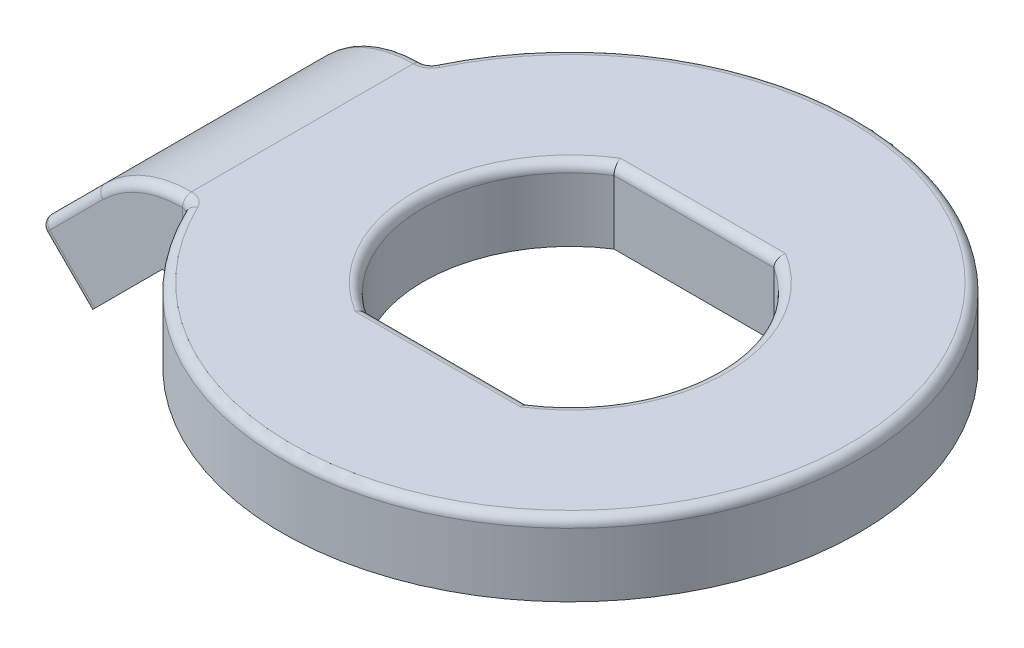
ISO-10303-21;
HEADER;
FILE_DESCRIPTION(('STEP AP214'),'2;1');
FILE_NAME('part.step','',(''),(''),'','','');
FILE_SCHEMA(('AUTOMOTIVE_DESIGN { 1 0 10303 214 1 1 1 1 }'));
ENDSEC;
DATA;
#1=APPLICATION_CONTEXT('core data for automotive mechanical design processes');
#2=APPLICATION_PROTOCOL_DEFINITION('international standard','automotive_design',2000,#1);
#3=PRODUCT_CONTEXT('',#1,'mechanical');
#4=PRODUCT('Part','Part','',(#3));
#5=PRODUCT_RELATED_PRODUCT_CATEGORY('part','',(#4));
#6=PRODUCT_DEFINITION_FORMATION('','',#4);
#7=PRODUCT_DEFINITION_CONTEXT('part definition',#1,'design');
#8=PRODUCT_DEFINITION('design','',#6,#7);
#9=PRODUCT_DEFINITION_SHAPE('','',#8);
#10=(LENGTH_UNIT() NAMED_UNIT(*) SI_UNIT(.MILLI.,.METRE.));
#11=(NAMED_UNIT(*) PLANE_ANGLE_UNIT() SI_UNIT($,.RADIAN.));
#12=(NAMED_UNIT(*) SI_UNIT($,.STERADIAN.) SOLID_ANGLE_UNIT());
#13=UNCERTAINTY_MEASURE_WITH_UNIT(LENGTH_MEASURE(1.E-05),#10,'distance_accuracy_value','');
#14=(GEOMETRIC_REPRESENTATION_CONTEXT(3) GLOBAL_UNCERTAINTY_ASSIGNED_CONTEXT((#13)) GLOBAL_UNIT_ASSIGNED_CONTEXT((#10,
#11,#12)) REPRESENTATION_CONTEXT('',''));
#15=CARTESIAN_POINT('',(0.,0.,0.));
#16=DIRECTION('',(0.,0.,1.));
#17=DIRECTION('',(1.,0.,0.));
#18=AXIS2_PLACEMENT_3D('',#15,#16,#17);
#19=CARTESIAN_POINT('',(0.,3.03784,0.));
#20=DIRECTION('',(0.,1.,0.));
#21=DIRECTION('',(0.,0.,1.));
#22=AXIS2_PLACEMENT_3D('',#19,#20,#21);
#23=PLANE('',#22);
#24=DIRECTION('',(-1.,0.,0.));
#25=VECTOR('',#24,1.);
#26=CARTESIAN_POINT('',(0.,3.03784,-5.5372));
#27=LINE('',#26,#25);
#28=CARTESIAN_POINT('',(-3.44510177824982,3.03784,-5.53719999999999));
#29=VERTEX_POINT('',#28);
#30=CARTESIAN_POINT('',(3.44510177824982,3.03784,-5.5372));
#31=VERTEX_POINT('',#30);
#32=EDGE_CURVE('E291',#29,#31,#27,.F.);
#33=ORIENTED_EDGE('',*,*,#32,.T.);
#34=CARTESIAN_POINT('',(0.,3.03784,0.));
#35=DIRECTION('',(0.,1.,0.));
#36=DIRECTION('',(0.,0.,1.));
#37=AXIS2_PLACEMENT_3D('',#34,#35,#36);
#38=CIRCLE('',#37,6.52145);
#39=CARTESIAN_POINT('',(3.44510177824982,3.03784,5.5372));
#40=VERTEX_POINT('',#39);
#41=EDGE_CURVE('E293',#31,#40,#38,.F.);
#42=ORIENTED_EDGE('',*,*,#41,.T.);
#43=DIRECTION('',(1.,0.,0.));
#44=VECTOR('',#43,1.);
#45=CARTESIAN_POINT('',(0.,3.03784,5.5372));
#46=LINE('',#45,#44);
#47=CARTESIAN_POINT('',(-3.44510177824982,3.03784,5.5372));
#48=VERTEX_POINT('',#47);
#49=EDGE_CURVE('E287',#40,#48,#46,.F.);
#50=ORIENTED_EDGE('',*,*,#49,.T.);
#51=CARTESIAN_POINT('',(0.,3.03784,0.));
#52=DIRECTION('',(0.,1.,0.));
#53=DIRECTION('',(0.,0.,1.));
#54=AXIS2_PLACEMENT_3D('',#51,#52,#53);
#55=CIRCLE('',#54,6.52145);
#56=EDGE_CURVE('E289',#48,#29,#55,.F.);
#57=ORIENTED_EDGE('',*,*,#56,.T.);
#58=EDGE_LOOP('',(#33,#42,#50,#57));
#59=FACE_BOUND('',#58,.T.);
#60=DIRECTION('',(0.,0.,-1.));
#61=VECTOR('',#60,1.);
#62=CARTESIAN_POINT('',(-11.1810096314642,3.03784,5.0038));
#63=LINE('',#62,#61);
#64=CARTESIAN_POINT('',(-11.1810096314642,3.03784,-4.6228));
#65=VERTEX_POINT('',#64);
#66=CARTESIAN_POINT('',(-11.1810096314642,3.03784,4.6228));
#67=VERTEX_POINT('',#66);
#68=EDGE_CURVE('E254',#65,#67,#63,.F.);
#69=ORIENTED_EDGE('',*,*,#68,.T.);
#70=DIRECTION('',(-1.,0.,0.));
#71=VECTOR('',#70,1.);
#72=CARTESIAN_POINT('',(0.,3.03784,4.6228));
#73=LINE('',#72,#71);
#74=CARTESIAN_POINT('',(-11.1785469256966,3.03784,4.6228));
#75=VERTEX_POINT('',#74);
#76=EDGE_CURVE('E306',#67,#75,#73,.F.);
#77=ORIENTED_EDGE('',*,*,#76,.T.);
#78=CARTESIAN_POINT('',(-11.1785469256966,3.03784,5.3848));
#79=DIRECTION('',(0.,1.,0.));
#80=DIRECTION('',(0.,0.,1.));
#81=AXIS2_PLACEMENT_3D('',#78,#79,#80);
#82=CIRCLE('',#81,0.762);
#83=CARTESIAN_POINT('',(-10.4920445556435,3.03784,5.05410603889458));
#84=VERTEX_POINT('',#83);
#85=EDGE_CURVE('E303',#84,#75,#82,.T.);
#86=ORIENTED_EDGE('',*,*,#85,.F.);
#87=CARTESIAN_POINT('',(0.,3.03784,0.));
#88=DIRECTION('',(0.,1.,0.));
#89=DIRECTION('',(0.,0.,1.));
#90=AXIS2_PLACEMENT_3D('',#87,#88,#89);
#91=CIRCLE('',#90,11.6459);
#92=CARTESIAN_POINT('',(-10.4920445556435,3.03784,-5.05410603889458));
#93=VERTEX_POINT('',#92);
#94=EDGE_CURVE('E301',#84,#93,#91,.T.);
#95=ORIENTED_EDGE('',*,*,#94,.T.);
#96=CARTESIAN_POINT('',(-11.1785469256966,3.03784,-5.3848));
#97=DIRECTION('',(0.,1.,0.));
#98=DIRECTION('',(0.,0.,1.));
#99=AXIS2_PLACEMENT_3D('',#96,#97,#98);
#100=CIRCLE('',#99,0.762);
#101=CARTESIAN_POINT('',(-11.1785469256966,3.03784,-4.6228));
#102=VERTEX_POINT('',#101);
#103=EDGE_CURVE('E298',#102,#93,#100,.T.);
#104=ORIENTED_EDGE('',*,*,#103,.F.);
#105=DIRECTION('',(-1.,0.,0.));
#106=VECTOR('',#105,1.);
#107=CARTESIAN_POINT('',(-11.1810096314642,3.03784,-4.6228));
#108=LINE('',#107,#106);
#109=EDGE_CURVE('E296',#102,#65,#108,.T.);
#110=ORIENTED_EDGE('',*,*,#109,.T.);
#111=EDGE_LOOP('',(#69,#77,#86,#95,#104,#110));
#112=FACE_BOUND('',#111,.T.);
#113=ADVANCED_FACE('F41',(#59,#112),#23,.T.);
#114=CARTESIAN_POINT('',(0.,0.,0.));
#115=DIRECTION('',(0.,1.,0.));
#116=DIRECTION('',(0.,0.,1.));
#117=AXIS2_PLACEMENT_3D('',#114,#115,#116);
#118=PLANE('',#117);
#119=CARTESIAN_POINT('',(0.,0.,0.));
#120=DIRECTION('',(0.,1.,0.));
#121=DIRECTION('',(0.,0.,1.));
#122=AXIS2_PLACEMENT_3D('',#119,#120,#121);
#123=CIRCLE('',#122,6.14045);
#124=CARTESIAN_POINT('',(-3.33447563531359,0.,-5.1562));
#125=VERTEX_POINT('',#124);
#126=CARTESIAN_POINT('',(-3.33447563531359,0.,5.1562));
#127=VERTEX_POINT('',#126);
#128=EDGE_CURVE('E228',#125,#127,#123,.T.);
#129=ORIENTED_EDGE('',*,*,#128,.T.);
#130=DIRECTION('',(1.,0.,0.));
#131=VECTOR('',#130,1.);
#132=CARTESIAN_POINT('',(3.33447563531359,0.,5.1562));
#133=LINE('',#132,#131);
#134=CARTESIAN_POINT('',(3.33447563531359,0.,5.1562));
#135=VERTEX_POINT('',#134);
#136=EDGE_CURVE('E231',#127,#135,#133,.T.);
#137=ORIENTED_EDGE('',*,*,#136,.T.);
#138=CARTESIAN_POINT('',(0.,0.,0.));
#139=DIRECTION('',(0.,1.,0.));
#140=DIRECTION('',(0.,0.,1.));
#141=AXIS2_PLACEMENT_3D('',#138,#139,#140);
#142=CIRCLE('',#141,6.14045);
#143=CARTESIAN_POINT('',(3.33447563531359,0.,-5.1562));
#144=VERTEX_POINT('',#143);
#145=EDGE_CURVE('E234',#135,#144,#142,.T.);
#146=ORIENTED_EDGE('',*,*,#145,.T.);
#147=DIRECTION('',(-1.,0.,0.));
#148=VECTOR('',#147,1.);
#149=CARTESIAN_POINT('',(-3.33447563531359,0.,-5.1562));
#150=LINE('',#149,#148);
#151=EDGE_CURVE('E237',#144,#125,#150,.T.);
#152=ORIENTED_EDGE('',*,*,#151,.T.);
#153=EDGE_LOOP('',(#129,#137,#146,#152));
#154=FACE_BOUND('',#153,.T.);
#155=CARTESIAN_POINT('',(0.,0.,0.));
#156=DIRECTION('',(0.,1.,0.));
#157=DIRECTION('',(0.,0.,1.));
#158=AXIS2_PLACEMENT_3D('',#155,#156,#157);
#159=CIRCLE('',#158,12.0269);
#160=CARTESIAN_POINT('',(-10.8352957406701,0.,5.21945301944729));
#161=VERTEX_POINT('',#160);
#162=CARTESIAN_POINT('',(-10.8352957406701,0.,-5.21945301944729));
#163=VERTEX_POINT('',#162);
#164=EDGE_CURVE('E248',#161,#163,#159,.T.);
#165=ORIENTED_EDGE('',*,*,#164,.F.);
#166=CARTESIAN_POINT('',(-11.1785469256966,0.,5.3848));
#167=DIRECTION('',(0.,1.,0.));
#168=DIRECTION('',(0.,0.,1.));
#169=AXIS2_PLACEMENT_3D('',#166,#167,#168);
#170=CIRCLE('',#169,0.381);
#171=CARTESIAN_POINT('',(-11.1785469256966,0.,5.0038));
#172=VERTEX_POINT('',#171);
#173=EDGE_CURVE('E55',#161,#172,#170,.T.);
#174=ORIENTED_EDGE('',*,*,#173,.T.);
#175=DIRECTION('',(1.,0.,0.));
#176=VECTOR('',#175,1.);
#177=CARTESIAN_POINT('',(-12.0269,0.,5.0038));
#178=LINE('',#177,#176);
#179=CARTESIAN_POINT('',(-12.0269,0.,5.0038));
#180=VERTEX_POINT('',#179);
#181=EDGE_CURVE('E199',#180,#172,#178,.T.);
#182=ORIENTED_EDGE('',*,*,#181,.F.);
#183=DIRECTION('',(0.,0.,-1.));
#184=VECTOR('',#183,1.);
#185=CARTESIAN_POINT('',(-12.0269,0.,5.0038));
#186=LINE('',#185,#184);
#187=CARTESIAN_POINT('',(-12.0269,0.,-5.0038));
#188=VERTEX_POINT('',#187);
#189=EDGE_CURVE('E209',#180,#188,#186,.T.);
#190=ORIENTED_EDGE('',*,*,#189,.T.);
#191=DIRECTION('',(1.,0.,0.));
#192=VECTOR('',#191,1.);
#193=CARTESIAN_POINT('',(-12.0269,0.,-5.0038));
#194=LINE('',#193,#192);
#195=CARTESIAN_POINT('',(-11.1785469256966,0.,-5.0038));
#196=VERTEX_POINT('',#195);
#197=EDGE_CURVE('E206',#188,#196,#194,.T.);
#198=ORIENTED_EDGE('',*,*,#197,.T.);
#199=CARTESIAN_POINT('',(-11.1785469256966,0.,-5.3848));
#200=DIRECTION('',(0.,1.,0.));
#201=DIRECTION('',(0.,0.,1.));
#202=AXIS2_PLACEMENT_3D('',#199,#200,#201);
#203=CIRCLE('',#202,0.381);
#204=EDGE_CURVE('E11',#196,#163,#203,.T.);
#205=ORIENTED_EDGE('',*,*,#204,.T.);
#206=EDGE_LOOP('',(#165,#174,#182,#190,#198,#205));
#207=FACE_BOUND('',#206,.T.);
#208=ADVANCED_FACE('F219',(#154,#207),#118,.F.);
#209=CARTESIAN_POINT('',(0.,3.03784,0.));
#210=DIRECTION('',(0.,-1.,0.));
#211=DIRECTION('',(0.,0.,-1.));
#212=AXIS2_PLACEMENT_3D('',#209,#210,#211);
#213=CYLINDRICAL_SURFACE('',#212,12.0269);
#214=CARTESIAN_POINT('',(0.,2.65684,0.));
#215=DIRECTION('',(0.,1.,0.));
#216=DIRECTION('',(0.,0.,1.));
#217=AXIS2_PLACEMENT_3D('',#214,#215,#216);
#218=CIRCLE('',#217,12.0269);
#219=CARTESIAN_POINT('',(-10.8352957406701,2.65684,-5.21945301944729));
#220=VERTEX_POINT('',#219);
#221=CARTESIAN_POINT('',(-10.8352957406701,2.65684,5.21945301944729));
#222=VERTEX_POINT('',#221);
#223=EDGE_CURVE('E310',#220,#222,#218,.F.);
#224=ORIENTED_EDGE('',*,*,#223,.T.);
#225=DIRECTION('',(0.,-1.,0.));
#226=VECTOR('',#225,1.);
#227=CARTESIAN_POINT('',(-10.8352957406701,3.03784,5.21945301944729));
#228=LINE('',#227,#226);
#229=EDGE_CURVE('E312',#222,#161,#228,.T.);
#230=ORIENTED_EDGE('',*,*,#229,.T.);
#231=ORIENTED_EDGE('',*,*,#164,.T.);
#232=DIRECTION('',(0.,-1.,0.));
#233=VECTOR('',#232,1.);
#234=CARTESIAN_POINT('',(-10.8352957406701,3.03784,-5.21945301944729));
#235=LINE('',#234,#233);
#236=EDGE_CURVE('E308',#163,#220,#235,.F.);
#237=ORIENTED_EDGE('',*,*,#236,.T.);
#238=EDGE_LOOP('',(#224,#230,#231,#237));
#239=FACE_BOUND('',#238,.T.);
#240=ADVANCED_FACE('F442',(#239),#213,.T.);
#241=CARTESIAN_POINT('',(0.,3.03784,0.));
#242=DIRECTION('',(0.,-1.,0.));
#243=DIRECTION('',(0.,0.,-1.));
#244=AXIS2_PLACEMENT_3D('',#241,#242,#243);
#245=CYLINDRICAL_SURFACE('',#244,6.14045);
#246=DIRECTION('',(0.,-1.,0.));
#247=VECTOR('',#246,1.);
#248=CARTESIAN_POINT('',(-3.33447563531359,3.03784,-5.1562));
#249=LINE('',#248,#247);
#250=CARTESIAN_POINT('',(-3.33447563531359,2.65684,-5.1562));
#251=VERTEX_POINT('',#250);
#252=EDGE_CURVE('E240',#251,#125,#249,.T.);
#253=ORIENTED_EDGE('',*,*,#252,.F.);
#254=CARTESIAN_POINT('',(0.,2.65684,0.));
#255=DIRECTION('',(0.,1.,0.));
#256=DIRECTION('',(0.,0.,1.));
#257=AXIS2_PLACEMENT_3D('',#254,#255,#256);
#258=CIRCLE('',#257,6.14045);
#259=CARTESIAN_POINT('',(-3.33447563531359,2.65684,5.1562));
#260=VERTEX_POINT('',#259);
#261=EDGE_CURVE('E319',#251,#260,#258,.T.);
#262=ORIENTED_EDGE('',*,*,#261,.T.);
#263=DIRECTION('',(0.,-1.,0.));
#264=VECTOR('',#263,1.);
#265=CARTESIAN_POINT('',(-3.33447563531359,3.03784,5.1562));
#266=LINE('',#265,#264);
#267=EDGE_CURVE('E246',#260,#127,#266,.T.);
#268=ORIENTED_EDGE('',*,*,#267,.T.);
#269=ORIENTED_EDGE('',*,*,#128,.F.);
#270=EDGE_LOOP('',(#253,#262,#268,#269));
#271=FACE_BOUND('',#270,.T.);
#272=ADVANCED_FACE('F440',(#271),#245,.F.);
#273=CARTESIAN_POINT('',(3.33447563531359,3.03784,5.1562));
#274=DIRECTION('',(0.,0.,-1.));
#275=DIRECTION('',(-1.,0.,0.));
#276=AXIS2_PLACEMENT_3D('',#273,#274,#275);
#277=PLANE('',#276);
#278=ORIENTED_EDGE('',*,*,#267,.F.);
#279=DIRECTION('',(1.,0.,0.));
#280=VECTOR('',#279,1.);
#281=CARTESIAN_POINT('',(3.33447563531359,2.65684,5.1562));
#282=LINE('',#281,#280);
#283=CARTESIAN_POINT('',(3.33447563531359,2.65684,5.1562));
#284=VERTEX_POINT('',#283);
#285=EDGE_CURVE('E321',#260,#284,#282,.T.);
#286=ORIENTED_EDGE('',*,*,#285,.T.);
#287=DIRECTION('',(0.,-1.,0.));
#288=VECTOR('',#287,1.);
#289=CARTESIAN_POINT('',(3.33447563531359,3.03784,5.1562));
#290=LINE('',#289,#288);
#291=EDGE_CURVE('E244',#284,#135,#290,.T.);
#292=ORIENTED_EDGE('',*,*,#291,.T.);
#293=ORIENTED_EDGE('',*,*,#136,.F.);
#294=EDGE_LOOP('',(#278,#286,#292,#293));
#295=FACE_BOUND('',#294,.T.);
#296=ADVANCED_FACE('F436',(#295),#277,.T.);
#297=CARTESIAN_POINT('',(0.,3.03784,0.));
#298=DIRECTION('',(0.,-1.,0.));
#299=DIRECTION('',(0.,0.,-1.));
#300=AXIS2_PLACEMENT_3D('',#297,#298,#299);
#301=CYLINDRICAL_SURFACE('',#300,6.14045);
#302=ORIENTED_EDGE('',*,*,#291,.F.);
#303=CARTESIAN_POINT('',(0.,2.65684,0.));
#304=DIRECTION('',(0.,1.,0.));
#305=DIRECTION('',(0.,0.,1.));
#306=AXIS2_PLACEMENT_3D('',#303,#304,#305);
#307=CIRCLE('',#306,6.14045);
#308=CARTESIAN_POINT('',(3.33447563531359,2.65684,-5.1562));
#309=VERTEX_POINT('',#308);
#310=EDGE_CURVE('E314',#284,#309,#307,.T.);
#311=ORIENTED_EDGE('',*,*,#310,.T.);
#312=DIRECTION('',(0.,-1.,0.));
#313=VECTOR('',#312,1.);
#314=CARTESIAN_POINT('',(3.33447563531359,3.03784,-5.1562));
#315=LINE('',#314,#313);
#316=EDGE_CURVE('E242',#309,#144,#315,.T.);
#317=ORIENTED_EDGE('',*,*,#316,.T.);
#318=ORIENTED_EDGE('',*,*,#145,.F.);
#319=EDGE_LOOP('',(#302,#311,#317,#318));
#320=FACE_BOUND('',#319,.T.);
#321=ADVANCED_FACE('F427',(#320),#301,.F.);
#322=CARTESIAN_POINT('',(-3.33447563531359,3.03784,-5.1562));
#323=DIRECTION('',(0.,0.,1.));
#324=DIRECTION('',(1.,0.,0.));
#325=AXIS2_PLACEMENT_3D('',#322,#323,#324);
#326=PLANE('',#325);
#327=ORIENTED_EDGE('',*,*,#316,.F.);
#328=DIRECTION('',(-1.,0.,0.));
#329=VECTOR('',#328,1.);
#330=CARTESIAN_POINT('',(-3.33447563531359,2.65684,-5.1562));
#331=LINE('',#330,#329);
#332=EDGE_CURVE('E317',#309,#251,#331,.T.);
#333=ORIENTED_EDGE('',*,*,#332,.T.);
#334=ORIENTED_EDGE('',*,*,#252,.T.);
#335=ORIENTED_EDGE('',*,*,#151,.F.);
#336=EDGE_LOOP('',(#327,#333,#334,#335));
#337=FACE_BOUND('',#336,.T.);
#338=ADVANCED_FACE('F430',(#337),#326,.T.);
#339=CARTESIAN_POINT('',(0.,0.,5.0038));
#340=DIRECTION('',(0.,0.,1.));
#341=DIRECTION('',(1.,0.,0.));
#342=AXIS2_PLACEMENT_3D('',#339,#340,#341);
#343=PLANE('',#342);
#344=ORIENTED_EDGE('',*,*,#181,.T.);
#345=DIRECTION('',(0.,-1.,0.));
#346=VECTOR('',#345,1.);
#347=CARTESIAN_POINT('',(-11.1785469256966,0.,5.0038));
#348=LINE('',#347,#346);
#349=CARTESIAN_POINT('',(-11.1785469256966,2.65684,5.0038));
#350=VERTEX_POINT('',#349);
#351=EDGE_CURVE('E264',#172,#350,#348,.F.);
#352=ORIENTED_EDGE('',*,*,#351,.T.);
#353=DIRECTION('',(-1.,0.,0.));
#354=VECTOR('',#353,1.);
#355=CARTESIAN_POINT('',(0.,2.65684,5.0038));
#356=LINE('',#355,#354);
#357=CARTESIAN_POINT('',(-11.1810096314642,2.65684,5.0038));
#358=VERTEX_POINT('',#357);
#359=EDGE_CURVE('E262',#350,#358,#356,.T.);
#360=ORIENTED_EDGE('',*,*,#359,.T.);
#361=CARTESIAN_POINT('',(-11.1810096314642,-2.04216,5.0038));
#362=DIRECTION('',(0.,0.,1.));
#363=DIRECTION('',(1.,0.,0.));
#364=AXIS2_PLACEMENT_3D('',#361,#362,#363);
#365=CIRCLE('',#364,4.699);
#366=CARTESIAN_POINT('',(-14.5037043962597,1.28053476479558,5.0038));
#367=VERTEX_POINT('',#366);
#368=EDGE_CURVE('E260',#358,#367,#365,.T.);
#369=ORIENTED_EDGE('',*,*,#368,.T.);
#370=DIRECTION('',(-0.707106781186546,-0.707106781186549,0.));
#371=VECTOR('',#370,1.);
#372=CARTESIAN_POINT('',(-16.9857974300544,-1.20155826899906,5.0038));
#373=LINE('',#372,#371);
#374=CARTESIAN_POINT('',(-16.7163897464223,-0.932150585366987,5.0038));
#375=VERTEX_POINT('',#374);
#376=EDGE_CURVE('E258',#367,#375,#373,.T.);
#377=ORIENTED_EDGE('',*,*,#376,.T.);
#378=DIRECTION('',(0.707106781186549,-0.707106781186546,0.));
#379=VECTOR('',#378,1.);
#380=CARTESIAN_POINT('',(-14.8377201658946,-2.81082016589465,5.0038));
#381=LINE('',#380,#379);
#382=CARTESIAN_POINT('',(-14.8377201658946,-2.81082016589465,5.0038));
#383=VERTEX_POINT('',#382);
#384=EDGE_CURVE('E203',#375,#383,#381,.T.);
#385=ORIENTED_EDGE('',*,*,#384,.T.);
#386=DIRECTION('',(0.707106781186546,0.707106781186549,0.));
#387=VECTOR('',#386,1.);
#388=CARTESIAN_POINT('',(-15.1071278495267,-3.08022784952673,5.0038));
#389=LINE('',#388,#387);
#390=EDGE_CURVE('E195',#383,#180,#389,.T.);
#391=ORIENTED_EDGE('',*,*,#390,.T.);
#392=EDGE_LOOP('',(#344,#352,#360,#369,#377,#385,#391));
#393=FACE_BOUND('',#392,.T.);
#394=ADVANCED_FACE('F197',(#393),#343,.T.);
#395=CARTESIAN_POINT('',(0.,0.,-5.0038));
#396=DIRECTION('',(0.,0.,1.));
#397=DIRECTION('',(1.,0.,0.));
#398=AXIS2_PLACEMENT_3D('',#395,#396,#397);
#399=PLANE('',#398);
#400=DIRECTION('',(-1.,0.,0.));
#401=VECTOR('',#400,1.);
#402=CARTESIAN_POINT('',(-10.9365583786674,2.65684,-5.0038));
#403=LINE('',#402,#401);
#404=CARTESIAN_POINT('',(-11.1810096314642,2.65684,-5.0038));
#405=VERTEX_POINT('',#404);
#406=CARTESIAN_POINT('',(-11.1785469256966,2.65684,-5.0038));
#407=VERTEX_POINT('',#406);
#408=EDGE_CURVE('E283',#405,#407,#403,.F.);
#409=ORIENTED_EDGE('',*,*,#408,.T.);
#410=DIRECTION('',(0.,1.,0.));
#411=VECTOR('',#410,1.);
#412=CARTESIAN_POINT('',(-11.1785469256966,0.,-5.0038));
#413=LINE('',#412,#411);
#414=EDGE_CURVE('E285',#407,#196,#413,.F.);
#415=ORIENTED_EDGE('',*,*,#414,.T.);
#416=ORIENTED_EDGE('',*,*,#197,.F.);
#417=DIRECTION('',(0.707106781186546,0.707106781186549,0.));
#418=VECTOR('',#417,1.);
#419=CARTESIAN_POINT('',(-15.1071278495267,-3.08022784952673,-5.0038));
#420=LINE('',#419,#418);
#421=CARTESIAN_POINT('',(-14.8377201658946,-2.81082016589465,-5.0038));
#422=VERTEX_POINT('',#421);
#423=EDGE_CURVE('E212',#422,#188,#420,.T.);
#424=ORIENTED_EDGE('',*,*,#423,.F.);
#425=DIRECTION('',(0.707106781186549,-0.707106781186546,0.));
#426=VECTOR('',#425,1.);
#427=CARTESIAN_POINT('',(-8.82427016589461,-8.82427016589465,-5.0038));
#428=LINE('',#427,#426);
#429=CARTESIAN_POINT('',(-16.7163897464223,-0.932150585366989,-5.0038));
#430=VERTEX_POINT('',#429);
#431=EDGE_CURVE('E277',#422,#430,#428,.F.);
#432=ORIENTED_EDGE('',*,*,#431,.T.);
#433=DIRECTION('',(-0.707106781186546,-0.707106781186549,0.));
#434=VECTOR('',#433,1.);
#435=CARTESIAN_POINT('',(-7.89211958052769,7.89211958052766,-5.0038));
#436=LINE('',#435,#434);
#437=CARTESIAN_POINT('',(-14.5037043962597,1.28053476479558,-5.0038));
#438=VERTEX_POINT('',#437);
#439=EDGE_CURVE('E279',#430,#438,#436,.F.);
#440=ORIENTED_EDGE('',*,*,#439,.T.);
#441=CARTESIAN_POINT('',(-11.1810096314642,-2.04216,-5.0038));
#442=DIRECTION('',(0.,0.,1.));
#443=DIRECTION('',(1.,0.,0.));
#444=AXIS2_PLACEMENT_3D('',#441,#442,#443);
#445=CIRCLE('',#444,4.699);
#446=EDGE_CURVE('E281',#438,#405,#445,.F.);
#447=ORIENTED_EDGE('',*,*,#446,.T.);
#448=EDGE_LOOP('',(#409,#415,#416,#424,#432,#440,#447));
#449=FACE_BOUND('',#448,.T.);
#450=ADVANCED_FACE('F563',(#449),#399,.F.);
#451=CARTESIAN_POINT('',(-13.2852145283195,3.03784,5.0038));
#452=DIRECTION('',(0.707106781186549,-0.707106781186546,0.));
#453=DIRECTION('',(0.707106781186546,0.707106781186549,0.));
#454=AXIS2_PLACEMENT_3D('',#451,#452,#453);
#455=PLANE('',#454);
#456=DIRECTION('',(0.,0.,-1.));
#457=VECTOR('',#456,1.);
#458=CARTESIAN_POINT('',(-16.9857974300544,-0.662742901734914,5.0038));
#459=LINE('',#458,#457);
#460=CARTESIAN_POINT('',(-16.9857974300544,-0.662742901734914,-4.6228));
#461=VERTEX_POINT('',#460);
#462=CARTESIAN_POINT('',(-16.9857974300544,-0.662742901734914,4.6228));
#463=VERTEX_POINT('',#462);
#464=EDGE_CURVE('E266',#461,#463,#459,.F.);
#465=ORIENTED_EDGE('',*,*,#464,.T.);
#466=DIRECTION('',(-0.707106781186546,-0.707106781186549,0.));
#467=VECTOR('',#466,1.);
#468=CARTESIAN_POINT('',(-14.7731120798918,1.54994244842765,4.6228));
#469=LINE('',#468,#467);
#470=CARTESIAN_POINT('',(-14.7731120798918,1.54994244842765,4.6228));
#471=VERTEX_POINT('',#470);
#472=EDGE_CURVE('E270',#463,#471,#469,.F.);
#473=ORIENTED_EDGE('',*,*,#472,.T.);
#474=DIRECTION('',(0.,0.,-1.));
#475=VECTOR('',#474,1.);
#476=CARTESIAN_POINT('',(-14.7731120798918,1.54994244842765,-5.0038));
#477=LINE('',#476,#475);
#478=CARTESIAN_POINT('',(-14.7731120798918,1.54994244842765,-4.6228));
#479=VERTEX_POINT('',#478);
#480=EDGE_CURVE('E251',#471,#479,#477,.T.);
#481=ORIENTED_EDGE('',*,*,#480,.T.);
#482=DIRECTION('',(-0.707106781186546,-0.707106781186549,0.));
#483=VECTOR('',#482,1.);
#484=CARTESIAN_POINT('',(-13.2852145283195,3.03784,-4.6228));
#485=LINE('',#484,#483);
#486=EDGE_CURVE('E268',#479,#461,#485,.T.);
#487=ORIENTED_EDGE('',*,*,#486,.T.);
#488=EDGE_LOOP('',(#465,#473,#481,#487));
#489=FACE_BOUND('',#488,.T.);
#490=ADVANCED_FACE('F556',(#489),#455,.F.);
#491=CARTESIAN_POINT('',(-17.2552051136865,-0.932150585366989,5.0038));
#492=DIRECTION('',(0.707106781186546,0.707106781186549,0.));
#493=DIRECTION('',(-0.707106781186549,0.707106781186546,0.));
#494=AXIS2_PLACEMENT_3D('',#491,#492,#493);
#495=PLANE('',#494);
#496=DIRECTION('',(0.,0.,-1.));
#497=VECTOR('',#496,1.);
#498=CARTESIAN_POINT('',(-15.1071278495267,-3.08022784952673,5.0038));
#499=LINE('',#498,#497);
#500=CARTESIAN_POINT('',(-15.1071278495267,-3.08022784952673,4.6228));
#501=VERTEX_POINT('',#500);
#502=CARTESIAN_POINT('',(-15.1071278495267,-3.08022784952673,-4.6228));
#503=VERTEX_POINT('',#502);
#504=EDGE_CURVE('E216',#501,#503,#499,.T.);
#505=ORIENTED_EDGE('',*,*,#504,.F.);
#506=DIRECTION('',(0.707106781186549,-0.707106781186546,0.));
#507=VECTOR('',#506,1.);
#508=CARTESIAN_POINT('',(-17.2552051136865,-0.932150585366989,4.6228));
#509=LINE('',#508,#507);
#510=CARTESIAN_POINT('',(-16.9857974300544,-1.20155826899906,4.6228));
#511=VERTEX_POINT('',#510);
#512=EDGE_CURVE('E63',#501,#511,#509,.F.);
#513=ORIENTED_EDGE('',*,*,#512,.T.);
#514=DIRECTION('',(0.,0.,-1.));
#515=VECTOR('',#514,1.);
#516=CARTESIAN_POINT('',(-16.9857974300544,-1.20155826899906,5.0038));
#517=LINE('',#516,#515);
#518=CARTESIAN_POINT('',(-16.9857974300544,-1.20155826899907,-4.6228));
#519=VERTEX_POINT('',#518);
#520=EDGE_CURVE('E67',#511,#519,#517,.T.);
#521=ORIENTED_EDGE('',*,*,#520,.T.);
#522=DIRECTION('',(0.707106781186549,-0.707106781186546,0.));
#523=VECTOR('',#522,1.);
#524=CARTESIAN_POINT('',(-17.2552051136865,-0.932150585366989,-4.6228));
#525=LINE('',#524,#523);
#526=EDGE_CURVE('E323',#519,#503,#525,.T.);
#527=ORIENTED_EDGE('',*,*,#526,.T.);
#528=EDGE_LOOP('',(#505,#513,#521,#527));
#529=FACE_BOUND('',#528,.T.);
#530=ADVANCED_FACE('F549',(#529),#495,.F.);
#531=CARTESIAN_POINT('',(-15.1071278495267,-3.08022784952673,5.0038));
#532=DIRECTION('',(-0.707106781186549,0.707106781186546,0.));
#533=DIRECTION('',(-0.707106781186546,-0.707106781186549,0.));
#534=AXIS2_PLACEMENT_3D('',#531,#532,#533);
#535=PLANE('',#534);
#536=ORIENTED_EDGE('',*,*,#390,.F.);
#537=CARTESIAN_POINT('',(-14.8377201658946,-2.81082016589465,4.6228));
#538=DIRECTION('',(-0.707106781186549,0.707106781186546,0.));
#539=DIRECTION('',(-0.707106781186546,-0.707106781186549,0.));
#540=AXIS2_PLACEMENT_3D('',#537,#538,#539);
#541=CIRCLE('',#540,0.381);
#542=EDGE_CURVE('E329',#383,#501,#541,.F.);
#543=ORIENTED_EDGE('',*,*,#542,.T.);
#544=ORIENTED_EDGE('',*,*,#504,.T.);
#545=CARTESIAN_POINT('',(-14.8377201658946,-2.81082016589465,-4.6228));
#546=DIRECTION('',(-0.707106781186549,0.707106781186546,0.));
#547=DIRECTION('',(-0.707106781186546,-0.707106781186549,0.));
#548=AXIS2_PLACEMENT_3D('',#545,#546,#547);
#549=CIRCLE('',#548,0.381);
#550=EDGE_CURVE('E327',#503,#422,#549,.F.);
#551=ORIENTED_EDGE('',*,*,#550,.T.);
#552=ORIENTED_EDGE('',*,*,#423,.T.);
#553=ORIENTED_EDGE('',*,*,#189,.F.);
#554=EDGE_LOOP('',(#536,#543,#544,#551,#552,#553));
#555=FACE_BOUND('',#554,.T.);
#556=ADVANCED_FACE('F210',(#555),#535,.F.);
#557=CARTESIAN_POINT('',(-11.1810096314642,-2.04216,5.0038));
#558=DIRECTION('',(0.,0.,1.));
#559=DIRECTION('',(1.,0.,0.));
#560=AXIS2_PLACEMENT_3D('',#557,#558,#559);
#561=CYLINDRICAL_SURFACE('',#560,5.08);
#562=ORIENTED_EDGE('',*,*,#480,.F.);
#563=CARTESIAN_POINT('',(-11.1810096314642,-2.04216,4.6228));
#564=DIRECTION('',(0.,0.,1.));
#565=DIRECTION('',(1.,0.,0.));
#566=AXIS2_PLACEMENT_3D('',#563,#564,#565);
#567=CIRCLE('',#566,5.08);
#568=EDGE_CURVE('E275',#471,#67,#567,.F.);
#569=ORIENTED_EDGE('',*,*,#568,.T.);
#570=ORIENTED_EDGE('',*,*,#68,.F.);
#571=CARTESIAN_POINT('',(-11.1810096314642,-2.04216,-4.6228));
#572=DIRECTION('',(0.,0.,1.));
#573=DIRECTION('',(1.,0.,0.));
#574=AXIS2_PLACEMENT_3D('',#571,#572,#573);
#575=CIRCLE('',#574,5.08);
#576=EDGE_CURVE('E273',#65,#479,#575,.T.);
#577=ORIENTED_EDGE('',*,*,#576,.T.);
#578=EDGE_LOOP('',(#562,#569,#570,#577));
#579=FACE_BOUND('',#578,.T.);
#580=ADVANCED_FACE('F458',(#579),#561,.T.);
#581=CARTESIAN_POINT('',(-11.1785469256966,3.03784,-5.3848));
#582=DIRECTION('',(0.,-1.,0.));
#583=DIRECTION('',(0.,0.,-1.));
#584=AXIS2_PLACEMENT_3D('',#581,#582,#583);
#585=CYLINDRICAL_SURFACE('',#584,0.381);
#586=ORIENTED_EDGE('',*,*,#204,.F.);
#587=ORIENTED_EDGE('',*,*,#414,.F.);
#588=CARTESIAN_POINT('',(-11.1785469256966,2.65684,-5.3848));
#589=DIRECTION('',(0.,1.,0.));
#590=DIRECTION('',(0.,0.,1.));
#591=AXIS2_PLACEMENT_3D('',#588,#589,#590);
#592=CIRCLE('',#591,0.381);
#593=EDGE_CURVE('E372',#220,#407,#592,.F.);
#594=ORIENTED_EDGE('',*,*,#593,.F.);
#595=ORIENTED_EDGE('',*,*,#236,.F.);
#596=EDGE_LOOP('',(#586,#587,#594,#595));
#597=FACE_BOUND('',#596,.T.);
#598=ADVANCED_FACE('F461',(#597),#585,.F.);
#599=CARTESIAN_POINT('',(0.,2.65684,-4.6228));
#600=DIRECTION('',(1.,0.,0.));
#601=DIRECTION('',(0.,0.,-1.));
#602=AXIS2_PLACEMENT_3D('',#599,#600,#601);
#603=CYLINDRICAL_SURFACE('',#602,0.381);
#604=CARTESIAN_POINT('',(-11.1810096314642,2.65684,-4.6228));
#605=DIRECTION('',(-1.,0.,0.));
#606=DIRECTION('',(0.,0.,1.));
#607=AXIS2_PLACEMENT_3D('',#604,#605,#606);
#608=CIRCLE('',#607,0.381);
#609=EDGE_CURVE('E369',#65,#405,#608,.T.);
#610=ORIENTED_EDGE('',*,*,#609,.F.);
#611=ORIENTED_EDGE('',*,*,#109,.F.);
#612=CARTESIAN_POINT('',(-11.1785469256966,2.65684,-4.6228));
#613=DIRECTION('',(1.,0.,0.));
#614=DIRECTION('',(0.,0.,-1.));
#615=AXIS2_PLACEMENT_3D('',#612,#613,#614);
#616=CIRCLE('',#615,0.381);
#617=EDGE_CURVE('E224',#407,#102,#616,.T.);
#618=ORIENTED_EDGE('',*,*,#617,.F.);
#619=ORIENTED_EDGE('',*,*,#408,.F.);
#620=EDGE_LOOP('',(#610,#611,#618,#619));
#621=FACE_BOUND('',#620,.T.);
#622=ADVANCED_FACE('F518',(#621),#603,.T.);
#623=CARTESIAN_POINT('',(-11.1785469256966,2.65684,-5.3848));
#624=DIRECTION('',(0.,1.,0.));
#625=DIRECTION('',(0.,0.,1.));
#626=AXIS2_PLACEMENT_3D('',#623,#624,#625);
#627=TOROIDAL_SURFACE('',#626,0.762,0.381);
#628=ORIENTED_EDGE('',*,*,#617,.T.);
#629=ORIENTED_EDGE('',*,*,#103,.T.);
#630=CARTESIAN_POINT('',(-10.4920445556435,2.65684,-5.05410603889458));
#631=DIRECTION('',(-0.433981576253837,0.,0.900921745476395));
#632=DIRECTION('',(0.900921745476396,0.,0.433981576253837));
#633=AXIS2_PLACEMENT_3D('',#630,#631,#632);
#634=CIRCLE('',#633,0.381);
#635=EDGE_CURVE('E366',#220,#93,#634,.F.);
#636=ORIENTED_EDGE('',*,*,#635,.F.);
#637=ORIENTED_EDGE('',*,*,#593,.T.);
#638=EDGE_LOOP('',(#628,#629,#636,#637));
#639=FACE_BOUND('',#638,.T.);
#640=ADVANCED_FACE('F514',(#639),#627,.T.);
#641=CARTESIAN_POINT('',(-11.1810096314642,-2.04216,-4.6228));
#642=DIRECTION('',(0.,0.,1.));
#643=DIRECTION('',(1.,0.,0.));
#644=AXIS2_PLACEMENT_3D('',#641,#642,#643);
#645=TOROIDAL_SURFACE('',#644,4.699,0.381);
#646=ORIENTED_EDGE('',*,*,#609,.T.);
#647=ORIENTED_EDGE('',*,*,#446,.F.);
#648=CARTESIAN_POINT('',(-14.5037043962597,1.28053476479558,-4.6228));
#649=DIRECTION('',(-0.707106781186545,-0.707106781186549,0.));
#650=DIRECTION('',(0.70710678118655,-0.707106781186545,0.));
#651=AXIS2_PLACEMENT_3D('',#648,#649,#650);
#652=CIRCLE('',#651,0.381);
#653=EDGE_CURVE('E363',#479,#438,#652,.T.);
#654=ORIENTED_EDGE('',*,*,#653,.F.);
#655=ORIENTED_EDGE('',*,*,#576,.F.);
#656=EDGE_LOOP('',(#646,#647,#654,#655));
#657=FACE_BOUND('',#656,.T.);
#658=ADVANCED_FACE('F510',(#657),#645,.T.);
#659=CARTESIAN_POINT('',(0.,2.65684,0.));
#660=DIRECTION('',(0.,1.,0.));
#661=DIRECTION('',(0.,0.,1.));
#662=AXIS2_PLACEMENT_3D('',#659,#660,#661);
#663=TOROIDAL_SURFACE('',#662,11.6459,0.381);
#664=ORIENTED_EDGE('',*,*,#635,.T.);
#665=ORIENTED_EDGE('',*,*,#94,.F.);
#666=CARTESIAN_POINT('',(-10.4920445556435,2.65684,5.05410603889458));
#667=DIRECTION('',(-0.433981576253837,0.,-0.900921745476395));
#668=DIRECTION('',(-0.900921745476396,0.,0.433981576253837));
#669=AXIS2_PLACEMENT_3D('',#666,#667,#668);
#670=CIRCLE('',#669,0.381);
#671=EDGE_CURVE('E360',#222,#84,#670,.T.);
#672=ORIENTED_EDGE('',*,*,#671,.F.);
#673=ORIENTED_EDGE('',*,*,#223,.F.);
#674=EDGE_LOOP('',(#664,#665,#672,#673));
#675=FACE_BOUND('',#674,.T.);
#676=ADVANCED_FACE('F506',(#675),#663,.T.);
#677=CARTESIAN_POINT('',(-11.1785469256966,3.03784,5.3848));
#678=DIRECTION('',(0.,-1.,0.));
#679=DIRECTION('',(0.,0.,-1.));
#680=AXIS2_PLACEMENT_3D('',#677,#678,#679);
#681=CYLINDRICAL_SURFACE('',#680,0.381);
#682=ORIENTED_EDGE('',*,*,#173,.F.);
#683=ORIENTED_EDGE('',*,*,#229,.F.);
#684=CARTESIAN_POINT('',(-11.1785469256966,2.65684,5.3848));
#685=DIRECTION('',(0.,1.,0.));
#686=DIRECTION('',(0.,0.,1.));
#687=AXIS2_PLACEMENT_3D('',#684,#685,#686);
#688=CIRCLE('',#687,0.381);
#689=EDGE_CURVE('E357',#350,#222,#688,.F.);
#690=ORIENTED_EDGE('',*,*,#689,.F.);
#691=ORIENTED_EDGE('',*,*,#351,.F.);
#692=EDGE_LOOP('',(#682,#683,#690,#691));
#693=FACE_BOUND('',#692,.T.);
#694=ADVANCED_FACE('F502',(#693),#681,.F.);
#695=CARTESIAN_POINT('',(-16.9857974300544,-0.662742901734914,-4.6228));
#696=DIRECTION('',(0.707106781186549,-0.707106781186546,0.));
#697=DIRECTION('',(0.707106781186546,0.707106781186549,0.));
#698=AXIS2_PLACEMENT_3D('',#695,#696,#697);
#699=CYLINDRICAL_SURFACE('',#698,0.381);
#700=ORIENTED_EDGE('',*,*,#550,.F.);
#701=ORIENTED_EDGE('',*,*,#526,.F.);
#702=CARTESIAN_POINT('',(-16.7163897464223,-0.932150585366989,-4.6228));
#703=DIRECTION('',(-0.707106781186551,0.707106781186544,0.));
#704=DIRECTION('',(-0.707106781186544,-0.707106781186551,0.));
#705=AXIS2_PLACEMENT_3D('',#702,#703,#704);
#706=CIRCLE('',#705,0.381);
#707=EDGE_CURVE('E354',#430,#519,#706,.T.);
#708=ORIENTED_EDGE('',*,*,#707,.F.);
#709=ORIENTED_EDGE('',*,*,#431,.F.);
#710=EDGE_LOOP('',(#700,#701,#708,#709));
#711=FACE_BOUND('',#710,.T.);
#712=ADVANCED_FACE('F498',(#711),#699,.T.);
#713=CARTESIAN_POINT('',(-13.0158068446874,2.76843231636793,-4.6228));
#714=DIRECTION('',(-0.707106781186546,-0.707106781186549,0.));
#715=DIRECTION('',(0.707106781186549,-0.707106781186546,0.));
#716=AXIS2_PLACEMENT_3D('',#713,#714,#715);
#717=CYLINDRICAL_SURFACE('',#716,0.381);
#718=ORIENTED_EDGE('',*,*,#653,.T.);
#719=ORIENTED_EDGE('',*,*,#439,.F.);
#720=CARTESIAN_POINT('',(-16.7163897464223,-0.932150585366989,-4.6228));
#721=DIRECTION('',(-0.707106781186548,-0.707106781186547,0.));
#722=DIRECTION('',(0.707106781186547,-0.707106781186548,0.));
#723=AXIS2_PLACEMENT_3D('',#720,#721,#722);
#724=CIRCLE('',#723,0.381);
#725=EDGE_CURVE('E351',#461,#430,#724,.T.);
#726=ORIENTED_EDGE('',*,*,#725,.F.);
#727=ORIENTED_EDGE('',*,*,#486,.F.);
#728=EDGE_LOOP('',(#718,#719,#726,#727));
#729=FACE_BOUND('',#728,.T.);
#730=ADVANCED_FACE('F494',(#729),#717,.T.);
#731=CARTESIAN_POINT('',(-11.1785469256966,2.65684,5.3848));
#732=DIRECTION('',(0.,1.,0.));
#733=DIRECTION('',(0.,0.,1.));
#734=AXIS2_PLACEMENT_3D('',#731,#732,#733);
#735=TOROIDAL_SURFACE('',#734,0.762,0.381);
#736=ORIENTED_EDGE('',*,*,#671,.T.);
#737=ORIENTED_EDGE('',*,*,#85,.T.);
#738=CARTESIAN_POINT('',(-11.1785469256966,2.65684,4.6228));
#739=DIRECTION('',(1.,0.,0.));
#740=DIRECTION('',(0.,0.,-1.));
#741=AXIS2_PLACEMENT_3D('',#738,#739,#740);
#742=CIRCLE('',#741,0.381);
#743=EDGE_CURVE('E348',#350,#75,#742,.F.);
#744=ORIENTED_EDGE('',*,*,#743,.F.);
#745=ORIENTED_EDGE('',*,*,#689,.T.);
#746=EDGE_LOOP('',(#736,#737,#744,#745));
#747=FACE_BOUND('',#746,.T.);
#748=ADVANCED_FACE('F490',(#747),#735,.T.);
#749=CARTESIAN_POINT('',(-16.7163897464223,-0.932150585366989,-4.6228));
#750=DIRECTION('',(0.,0.,-1.));
#751=DIRECTION('',(0.,1.,0.));
#752=AXIS2_PLACEMENT_3D('',#749,#750,#751);
#753=SPHERICAL_SURFACE('',#752,0.381);
#754=ORIENTED_EDGE('',*,*,#725,.T.);
#755=ORIENTED_EDGE('',*,*,#707,.T.);
#756=CARTESIAN_POINT('',(-16.7163897464223,-0.93215058536699,-4.6228));
#757=DIRECTION('',(0.,0.,-1.));
#758=DIRECTION('',(-1.,0.,0.));
#759=AXIS2_PLACEMENT_3D('',#756,#757,#758);
#760=CIRCLE('',#759,0.381);
#761=EDGE_CURVE('E345',#461,#519,#760,.F.);
#762=ORIENTED_EDGE('',*,*,#761,.F.);
#763=EDGE_LOOP('',(#754,#755,#762));
#764=FACE_BOUND('',#763,.T.);
#765=ADVANCED_FACE('F486',(#764),#753,.T.);
#766=CARTESIAN_POINT('',(0.,2.65684,4.6228));
#767=DIRECTION('',(-1.,0.,0.));
#768=DIRECTION('',(0.,0.,1.));
#769=AXIS2_PLACEMENT_3D('',#766,#767,#768);
#770=CYLINDRICAL_SURFACE('',#769,0.381);
#771=ORIENTED_EDGE('',*,*,#743,.T.);
#772=ORIENTED_EDGE('',*,*,#76,.F.);
#773=CARTESIAN_POINT('',(-11.1810096314642,2.65684,4.6228));
#774=DIRECTION('',(-1.,0.,0.));
#775=DIRECTION('',(0.,0.,1.));
#776=AXIS2_PLACEMENT_3D('',#773,#774,#775);
#777=CIRCLE('',#776,0.381);
#778=EDGE_CURVE('E342',#358,#67,#777,.T.);
#779=ORIENTED_EDGE('',*,*,#778,.F.);
#780=ORIENTED_EDGE('',*,*,#359,.F.);
#781=EDGE_LOOP('',(#771,#772,#779,#780));
#782=FACE_BOUND('',#781,.T.);
#783=ADVANCED_FACE('F482',(#782),#770,.T.);
#784=CARTESIAN_POINT('',(-8.82427016589461,-8.82427016589465,4.6228));
#785=DIRECTION('',(-0.707106781186549,0.707106781186546,0.));
#786=DIRECTION('',(-0.707106781186546,-0.707106781186549,0.));
#787=AXIS2_PLACEMENT_3D('',#784,#785,#786);
#788=CYLINDRICAL_SURFACE('',#787,0.381);
#789=ORIENTED_EDGE('',*,*,#542,.F.);
#790=ORIENTED_EDGE('',*,*,#384,.F.);
#791=CARTESIAN_POINT('',(-16.7163897464223,-0.93215058536699,4.6228));
#792=DIRECTION('',(-0.70710678118655,0.707106781186546,0.));
#793=DIRECTION('',(-0.707106781186546,-0.70710678118655,0.));
#794=AXIS2_PLACEMENT_3D('',#791,#792,#793);
#795=CIRCLE('',#794,0.381);
#796=EDGE_CURVE('E339',#511,#375,#795,.T.);
#797=ORIENTED_EDGE('',*,*,#796,.F.);
#798=ORIENTED_EDGE('',*,*,#512,.F.);
#799=EDGE_LOOP('',(#789,#790,#797,#798));
#800=FACE_BOUND('',#799,.T.);
#801=ADVANCED_FACE('F478',(#800),#788,.T.);
#802=CARTESIAN_POINT('',(-16.7163897464223,-0.932150585366988,5.0038));
#803=DIRECTION('',(0.,0.,-1.));
#804=DIRECTION('',(-1.,0.,0.));
#805=AXIS2_PLACEMENT_3D('',#802,#803,#804);
#806=CYLINDRICAL_SURFACE('',#805,0.381);
#807=ORIENTED_EDGE('',*,*,#761,.T.);
#808=ORIENTED_EDGE('',*,*,#520,.F.);
#809=CARTESIAN_POINT('',(-16.7163897464223,-0.932150585366988,4.6228));
#810=DIRECTION('',(0.,0.,1.));
#811=DIRECTION('',(1.,0.,0.));
#812=AXIS2_PLACEMENT_3D('',#809,#810,#811);
#813=CIRCLE('',#812,0.381);
#814=EDGE_CURVE('E336',#463,#511,#813,.T.);
#815=ORIENTED_EDGE('',*,*,#814,.F.);
#816=ORIENTED_EDGE('',*,*,#464,.F.);
#817=EDGE_LOOP('',(#807,#808,#815,#816));
#818=FACE_BOUND('',#817,.T.);
#819=ADVANCED_FACE('F474',(#818),#806,.T.);
#820=CARTESIAN_POINT('',(-11.1810096314642,-2.04216,4.6228));
#821=DIRECTION('',(0.,0.,1.));
#822=DIRECTION('',(1.,0.,0.));
#823=AXIS2_PLACEMENT_3D('',#820,#821,#822);
#824=TOROIDAL_SURFACE('',#823,4.699,0.381);
#825=ORIENTED_EDGE('',*,*,#778,.T.);
#826=ORIENTED_EDGE('',*,*,#568,.F.);
#827=CARTESIAN_POINT('',(-14.5037043962597,1.28053476479558,4.6228));
#828=DIRECTION('',(-0.707106781186546,-0.70710678118655,0.));
#829=DIRECTION('',(0.70710678118655,-0.707106781186546,0.));
#830=AXIS2_PLACEMENT_3D('',#827,#828,#829);
#831=CIRCLE('',#830,0.381);
#832=EDGE_CURVE('E334',#367,#471,#831,.T.);
#833=ORIENTED_EDGE('',*,*,#832,.F.);
#834=ORIENTED_EDGE('',*,*,#368,.F.);
#835=EDGE_LOOP('',(#825,#826,#833,#834));
#836=FACE_BOUND('',#835,.T.);
#837=ADVANCED_FACE('F470',(#836),#824,.T.);
#838=CARTESIAN_POINT('',(-16.7163897464223,-0.932150585366988,4.6228));
#839=DIRECTION('',(-0.707106781186544,-0.707106781186551,0.));
#840=DIRECTION('',(0.707106781186551,-0.707106781186544,0.));
#841=AXIS2_PLACEMENT_3D('',#838,#839,#840);
#842=SPHERICAL_SURFACE('',#841,0.381);
#843=ORIENTED_EDGE('',*,*,#814,.T.);
#844=ORIENTED_EDGE('',*,*,#796,.T.);
#845=CARTESIAN_POINT('',(-16.7163897464223,-0.932150585366987,4.6228));
#846=DIRECTION('',(-0.707106781186546,-0.707106781186549,0.));
#847=DIRECTION('',(0.707106781186549,-0.707106781186546,0.));
#848=AXIS2_PLACEMENT_3D('',#845,#846,#847);
#849=CIRCLE('',#848,0.381);
#850=EDGE_CURVE('E332',#463,#375,#849,.F.);
#851=ORIENTED_EDGE('',*,*,#850,.F.);
#852=EDGE_LOOP('',(#843,#844,#851));
#853=FACE_BOUND('',#852,.T.);
#854=ADVANCED_FACE('F466',(#853),#842,.T.);
#855=CARTESIAN_POINT('',(-7.89211958052769,7.89211958052766,4.6228));
#856=DIRECTION('',(0.707106781186546,0.707106781186549,0.));
#857=DIRECTION('',(-0.707106781186549,0.707106781186546,0.));
#858=AXIS2_PLACEMENT_3D('',#855,#856,#857);
#859=CYLINDRICAL_SURFACE('',#858,0.381);
#860=ORIENTED_EDGE('',*,*,#832,.T.);
#861=ORIENTED_EDGE('',*,*,#472,.F.);
#862=ORIENTED_EDGE('',*,*,#850,.T.);
#863=ORIENTED_EDGE('',*,*,#376,.F.);
#864=EDGE_LOOP('',(#860,#861,#862,#863));
#865=FACE_BOUND('',#864,.T.);
#866=ADVANCED_FACE('F463',(#865),#859,.T.);
#867=CARTESIAN_POINT('',(0.,2.65684,0.));
#868=DIRECTION('',(0.,1.,0.));
#869=DIRECTION('',(0.,0.,1.));
#870=AXIS2_PLACEMENT_3D('',#867,#868,#869);
#871=TOROIDAL_SURFACE('',#870,6.52145,0.381);
#872=CARTESIAN_POINT('',(-3.33447563531359,2.65684,-5.1562));
#873=CARTESIAN_POINT('',(-3.33446903399603,2.67764735886621,-5.1561791355156));
#874=CARTESIAN_POINT('',(-3.33497834986007,2.69844398159205,-5.1579031263119));
#875=CARTESIAN_POINT('',(-3.33697829359163,2.73940009143768,-5.16468087161253));
#876=CARTESIAN_POINT('',(-3.33846706782412,2.75956070682909,-5.16972833642315));
#877=CARTESIAN_POINT('',(-3.34237587560458,2.79871326332391,-5.18299459596015));
#878=CARTESIAN_POINT('',(-3.3447959684723,2.81770512989517,-5.19121359269541));
#879=CARTESIAN_POINT('',(-3.35047881621608,2.85401627262938,-5.21054210750225));
#880=CARTESIAN_POINT('',(-3.35374166048209,2.87133537109527,-5.22165193220251));
#881=CARTESIAN_POINT('',(-3.36106597709733,2.90415868781405,-5.24663594120151));
#882=CARTESIAN_POINT('',(-3.36514058923414,2.9196252633141,-5.26055566530865));
#883=CARTESIAN_POINT('',(-3.37392096717777,2.94801766957352,-5.29061487345774));
#884=CARTESIAN_POINT('',(-3.37862695840288,2.96094258881489,-5.3067551503457));
#885=CARTESIAN_POINT('',(-3.38872251948104,2.98441129779198,-5.34146092055002));
#886=CARTESIAN_POINT('',(-3.39413149775985,2.99484355859519,-5.36009610415585));
#887=CARTESIAN_POINT('',(-3.40532146888187,3.01242734512376,-5.39874778600159));
#888=CARTESIAN_POINT('',(-3.41110236630927,3.01957970850947,-5.41876393005089));
#889=CARTESIAN_POINT('',(-3.42135621055237,3.02905736250402,-5.45436173090176));
#890=CARTESIAN_POINT('',(-3.42578268048508,3.03215135365578,-5.46975819751535));
#891=CARTESIAN_POINT('',(-3.43468434346721,3.03641743234207,-5.50078168983083));
#892=CARTESIAN_POINT('',(-3.43915943609429,3.03759292128999,-5.51640825781432));
#893=CARTESIAN_POINT('',(-3.44411805913252,3.03782835950823,-5.53375712271696));
#894=CARTESIAN_POINT('',(-3.44460999486394,3.03784003055832,-5.53547864201329));
#895=CARTESIAN_POINT('',(-3.44510177824981,3.03784,-5.5372));
#896=B_SPLINE_CURVE_WITH_KNOTS('',3,(#872,#873,#874,#875,#876,#877,#878,#879,#880,#881,#882,
#883,#884,#885,#886,#887,#888,#889,#890,#891,#892,#893,#894,#895),.UNSPECIFIED.,.F.,.F.,(4,2,2,
2,2,2,2,2,2,2,2,4),(0.,0.0623281874597638,0.124538756196019,0.186753288052638,0.248974421665754,
0.312299264088355,0.375646775542705,0.4414462421656,0.507228894743445,0.556073912021758,
0.604832234954914,0.610203452743599),.UNSPECIFIED.);
#897=EDGE_CURVE('E400',#29,#251,#896,.F.);
#898=ORIENTED_EDGE('',*,*,#897,.F.);
#899=ORIENTED_EDGE('',*,*,#56,.F.);
#900=CARTESIAN_POINT('',(-3.33447563531359,2.65684,5.1562));
#901=CARTESIAN_POINT('',(-3.33446903399603,2.67764735886621,5.1561791355156));
#902=CARTESIAN_POINT('',(-3.33497834986007,2.69844398159205,5.1579031263119));
#903=CARTESIAN_POINT('',(-3.33697829359163,2.73940009143768,5.16468087161253));
#904=CARTESIAN_POINT('',(-3.33846706782412,2.75956070682909,5.16972833642315));
#905=CARTESIAN_POINT('',(-3.34237587560458,2.79871326332391,5.18299459596015));
#906=CARTESIAN_POINT('',(-3.3447959684723,2.81770512989517,5.19121359269541));
#907=CARTESIAN_POINT('',(-3.35047881621608,2.85401627262938,5.21054210750225));
#908=CARTESIAN_POINT('',(-3.35374166048209,2.87133537109527,5.22165193220251));
#909=CARTESIAN_POINT('',(-3.36106597709733,2.90415868781405,5.24663594120151));
#910=CARTESIAN_POINT('',(-3.36514058923414,2.9196252633141,5.26055566530865));
#911=CARTESIAN_POINT('',(-3.37392096717777,2.94801766957352,5.29061487345774));
#912=CARTESIAN_POINT('',(-3.37862695840288,2.96094258881489,5.3067551503457));
#913=CARTESIAN_POINT('',(-3.38872251948104,2.98441129779198,5.34146092055002));
#914=CARTESIAN_POINT('',(-3.39413149775985,2.99484355859519,5.36009610415585));
#915=CARTESIAN_POINT('',(-3.40532146888187,3.01242734512376,5.39874778600159));
#916=CARTESIAN_POINT('',(-3.41110236630927,3.01957970850947,5.41876393005089));
#917=CARTESIAN_POINT('',(-3.42135621055237,3.02905736250402,5.45436173090176));
#918=CARTESIAN_POINT('',(-3.42578268048508,3.03215135365578,5.46975819751535));
#919=CARTESIAN_POINT('',(-3.43468434346721,3.03641743234207,5.50078168983083));
#920=CARTESIAN_POINT('',(-3.43915943609429,3.03759292128999,5.51640825781433));
#921=CARTESIAN_POINT('',(-3.44411805913252,3.03782835950823,5.53375712271696));
#922=CARTESIAN_POINT('',(-3.44460999486394,3.03784003055832,5.53547864201329));
#923=CARTESIAN_POINT('',(-3.44510177824981,3.03784,5.5372));
#924=B_SPLINE_CURVE_WITH_KNOTS('',3,(#900,#901,#902,#903,#904,#905,#906,#907,#908,#909,#910,
#911,#912,#913,#914,#915,#916,#917,#918,#919,#920,#921,#922,#923),.UNSPECIFIED.,.F.,.F.,(4,2,2,
2,2,2,2,2,2,2,2,4),(0.,0.0623281874597638,0.124538756196019,0.186753288052638,0.248974421665754,
0.312299264088355,0.375646775542705,0.4414462421656,0.507228894743445,0.556073912021759,
0.604832234954915,0.610203452743599),.UNSPECIFIED.);
#925=EDGE_CURVE('E46',#260,#48,#924,.T.);
#926=ORIENTED_EDGE('',*,*,#925,.F.);
#927=ORIENTED_EDGE('',*,*,#261,.F.);
#928=EDGE_LOOP('',(#898,#899,#926,#927));
#929=FACE_BOUND('',#928,.T.);
#930=ADVANCED_FACE('F43',(#929),#871,.T.);
#931=CARTESIAN_POINT('',(3.33447563531359,2.65684,5.5372));
#932=DIRECTION('',(1.,0.,0.));
#933=DIRECTION('',(0.,0.,-1.));
#934=AXIS2_PLACEMENT_3D('',#931,#932,#933);
#935=CYLINDRICAL_SURFACE('',#934,0.381);
#936=ORIENTED_EDGE('',*,*,#925,.T.);
#937=ORIENTED_EDGE('',*,*,#49,.F.);
#938=CARTESIAN_POINT('',(3.33447563531359,2.65684,5.1562));
#939=CARTESIAN_POINT('',(3.33446903399603,2.67764735886621,5.1561791355156));
#940=CARTESIAN_POINT('',(3.33497834986007,2.69844398159205,5.1579031263119));
#941=CARTESIAN_POINT('',(3.33697829359163,2.73940009143768,5.16468087161253));
#942=CARTESIAN_POINT('',(3.33846706782412,2.75956070682909,5.16972833642315));
#943=CARTESIAN_POINT('',(3.34237587560458,2.79871326332391,5.18299459596015));
#944=CARTESIAN_POINT('',(3.3447959684723,2.81770512989517,5.19121359269541));
#945=CARTESIAN_POINT('',(3.35047881621608,2.85401627262938,5.21054210750225));
#946=CARTESIAN_POINT('',(3.35374166048209,2.87133537109527,5.22165193220251));
#947=CARTESIAN_POINT('',(3.36106597709733,2.90415868781405,5.24663594120151));
#948=CARTESIAN_POINT('',(3.36514058923414,2.91962526331409,5.26055566530865));
#949=CARTESIAN_POINT('',(3.37392096717777,2.94801766957352,5.29061487345774));
#950=CARTESIAN_POINT('',(3.37862695840288,2.96094258881488,5.3067551503457));
#951=CARTESIAN_POINT('',(3.38872251948104,2.98441129779198,5.34146092055002));
#952=CARTESIAN_POINT('',(3.39413149775985,2.99484355859519,5.36009610415585));
#953=CARTESIAN_POINT('',(3.40532146888187,3.01242734512376,5.39874778600159));
#954=CARTESIAN_POINT('',(3.41110236630927,3.01957970850947,5.41876393005089));
#955=CARTESIAN_POINT('',(3.42135621055237,3.02905736250402,5.45436173090176));
#956=CARTESIAN_POINT('',(3.42578268048507,3.03215135365578,5.46975819751535));
#957=CARTESIAN_POINT('',(3.43468434346722,3.03641743234207,5.50078168983083));
#958=CARTESIAN_POINT('',(3.43915943609432,3.03759292128999,5.51640825781432));
#959=CARTESIAN_POINT('',(3.44411805913253,3.03782835950823,5.53375712271696));
#960=CARTESIAN_POINT('',(3.44460999486394,3.03784003055832,5.53547864201329));
#961=CARTESIAN_POINT('',(3.44510177824981,3.03784,5.5372));
#962=B_SPLINE_CURVE_WITH_KNOTS('',3,(#938,#939,#940,#941,#942,#943,#944,#945,#946,#947,#948,
#949,#950,#951,#952,#953,#954,#955,#956,#957,#958,#959,#960,#961),.UNSPECIFIED.,.F.,.F.,(4,2,2,
2,2,2,2,2,2,2,2,4),(0.,0.0623281874597638,0.124538756196019,0.186753288052638,0.248974421665754,
0.312299264088355,0.375646775542704,0.441446242165601,0.507228894743446,0.556073912021757,
0.604832234954914,0.610203452743599),.UNSPECIFIED.);
#963=EDGE_CURVE('E385',#284,#40,#962,.T.);
#964=ORIENTED_EDGE('',*,*,#963,.F.);
#965=ORIENTED_EDGE('',*,*,#285,.F.);
#966=EDGE_LOOP('',(#936,#937,#964,#965));
#967=FACE_BOUND('',#966,.T.);
#968=ADVANCED_FACE('F396',(#967),#935,.T.);
#969=CARTESIAN_POINT('',(-3.33447563531359,2.65684,-5.5372));
#970=DIRECTION('',(-1.,0.,0.));
#971=DIRECTION('',(0.,0.,1.));
#972=AXIS2_PLACEMENT_3D('',#969,#970,#971);
#973=CYLINDRICAL_SURFACE('',#972,0.381);
#974=ORIENTED_EDGE('',*,*,#897,.T.);
#975=ORIENTED_EDGE('',*,*,#332,.F.);
#976=CARTESIAN_POINT('',(3.33447563531359,2.65684,-5.1562));
#977=CARTESIAN_POINT('',(3.33446903399603,2.67764735886621,-5.1561791355156));
#978=CARTESIAN_POINT('',(3.33497834986007,2.69844398159205,-5.1579031263119));
#979=CARTESIAN_POINT('',(3.33697829359163,2.73940009143768,-5.16468087161253));
#980=CARTESIAN_POINT('',(3.33846706782412,2.75956070682909,-5.16972833642315));
#981=CARTESIAN_POINT('',(3.34237587560458,2.79871326332391,-5.18299459596015));
#982=CARTESIAN_POINT('',(3.3447959684723,2.81770512989517,-5.19121359269541));
#983=CARTESIAN_POINT('',(3.35047881621608,2.85401627262938,-5.21054210750225));
#984=CARTESIAN_POINT('',(3.35374166048209,2.87133537109527,-5.22165193220251));
#985=CARTESIAN_POINT('',(3.36106597709733,2.90415868781405,-5.24663594120151));
#986=CARTESIAN_POINT('',(3.36514058923414,2.9196252633141,-5.26055566530865));
#987=CARTESIAN_POINT('',(3.37392096717777,2.94801766957352,-5.29061487345774));
#988=CARTESIAN_POINT('',(3.37862695840288,2.96094258881489,-5.3067551503457));
#989=CARTESIAN_POINT('',(3.38872251948104,2.98441129779198,-5.34146092055002));
#990=CARTESIAN_POINT('',(3.39413149775985,2.99484355859519,-5.36009610415585));
#991=CARTESIAN_POINT('',(3.40532146888187,3.01242734512376,-5.39874778600159));
#992=CARTESIAN_POINT('',(3.41110236630927,3.01957970850947,-5.41876393005089));
#993=CARTESIAN_POINT('',(3.42135621055237,3.02905736250402,-5.45436173090176));
#994=CARTESIAN_POINT('',(3.42578268048508,3.03215135365578,-5.46975819751535));
#995=CARTESIAN_POINT('',(3.43468434346721,3.03641743234207,-5.50078168983083));
#996=CARTESIAN_POINT('',(3.4391594360943,3.03759292128999,-5.51640825781432));
#997=CARTESIAN_POINT('',(3.44411805913253,3.03782835950823,-5.53375712271696));
#998=CARTESIAN_POINT('',(3.44460999486394,3.03784003055832,-5.53547864201329));
#999=CARTESIAN_POINT('',(3.44510177824981,3.03784,-5.5372));
#1000=B_SPLINE_CURVE_WITH_KNOTS('',3,(#976,#977,#978,#979,#980,#981,#982,#983,#984,#985,#986,
#987,#988,#989,#990,#991,#992,#993,#994,#995,#996,#997,#998,#999),.UNSPECIFIED.,.F.,.F.,(4,2,2,
2,2,2,2,2,2,2,2,4),(0.,0.0623281874597639,0.12453875619602,0.186753288052638,0.248974421665754,
0.312299264088355,0.375646775542705,0.441446242165601,0.507228894743446,0.556073912021758,
0.604832234954914,0.610203452743599),.UNSPECIFIED.);
#1001=EDGE_CURVE('E377',#31,#309,#1000,.F.);
#1002=ORIENTED_EDGE('',*,*,#1001,.F.);
#1003=ORIENTED_EDGE('',*,*,#32,.F.);
#1004=EDGE_LOOP('',(#974,#975,#1002,#1003));
#1005=FACE_BOUND('',#1004,.T.);
#1006=ADVANCED_FACE('F393',(#1005),#973,.T.);
#1007=CARTESIAN_POINT('',(0.,2.65684,0.));
#1008=DIRECTION('',(0.,1.,0.));
#1009=DIRECTION('',(0.,0.,1.));
#1010=AXIS2_PLACEMENT_3D('',#1007,#1008,#1009);
#1011=TOROIDAL_SURFACE('',#1010,6.52145,0.381);
#1012=ORIENTED_EDGE('',*,*,#963,.T.);
#1013=ORIENTED_EDGE('',*,*,#41,.F.);
#1014=ORIENTED_EDGE('',*,*,#1001,.T.);
#1015=ORIENTED_EDGE('',*,*,#310,.F.);
#1016=EDGE_LOOP('',(#1012,#1013,#1014,#1015));
#1017=FACE_BOUND('',#1016,.T.);
#1018=ADVANCED_FACE('F390',(#1017),#1011,.T.);
#1019=CLOSED_SHELL('',(#113,#208,#240,#272,#296,#321,#338,#394,#450,#490,#530,#556,#580,#598,
#622,#640,#658,#676,#694,#712,#730,#748,#765,#783,#801,#819,#837,#854,#866,#930,#968,#1006,#1018));
#1020=MANIFOLD_SOLID_BREP('B2',#1019);
#1021=ADVANCED_BREP_SHAPE_REPRESENTATION('',(#18,#1020),#14);
#1022=SHAPE_DEFINITION_REPRESENTATION(#9,#1021);
ENDSEC;
END-ISO-10303-21;
